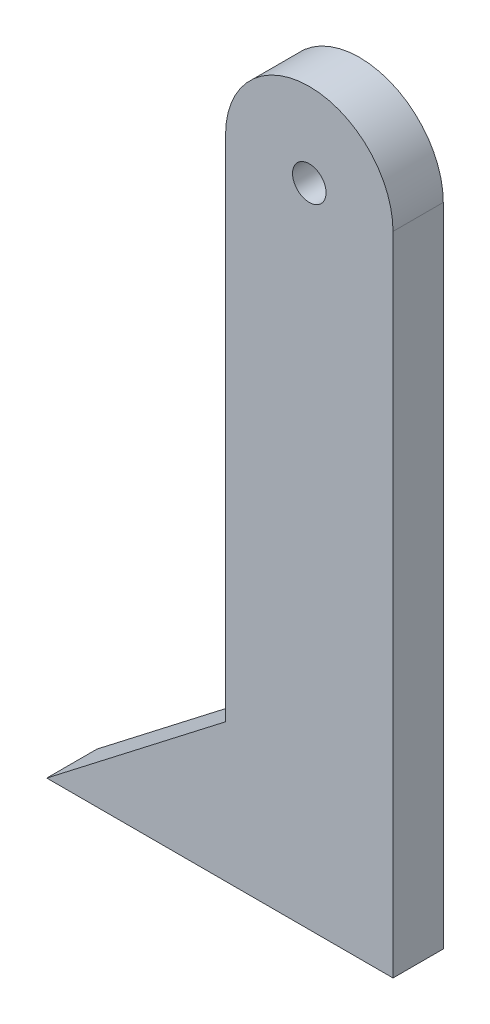
ISO-10303-21;
HEADER;
FILE_DESCRIPTION(('STEP AP214'),'2;1');
FILE_NAME('part.step','',(''),(''),'','','');
FILE_SCHEMA(('AUTOMOTIVE_DESIGN { 1 0 10303 214 1 1 1 1 }'));
ENDSEC;
DATA;
#1=APPLICATION_CONTEXT('core data for automotive mechanical design processes');
#2=APPLICATION_PROTOCOL_DEFINITION('international standard','automotive_design',2000,#1);
#3=PRODUCT_CONTEXT('',#1,'mechanical');
#4=PRODUCT('Part','Part','',(#3));
#5=PRODUCT_RELATED_PRODUCT_CATEGORY('part','',(#4));
#6=PRODUCT_DEFINITION_FORMATION('','',#4);
#7=PRODUCT_DEFINITION_CONTEXT('part definition',#1,'design');
#8=PRODUCT_DEFINITION('design','',#6,#7);
#9=PRODUCT_DEFINITION_SHAPE('','',#8);
#10=(LENGTH_UNIT() NAMED_UNIT(*) SI_UNIT(.MILLI.,.METRE.));
#11=(NAMED_UNIT(*) PLANE_ANGLE_UNIT() SI_UNIT($,.RADIAN.));
#12=(NAMED_UNIT(*) SI_UNIT($,.STERADIAN.) SOLID_ANGLE_UNIT());
#13=UNCERTAINTY_MEASURE_WITH_UNIT(LENGTH_MEASURE(1.E-05),#10,'distance_accuracy_value','');
#14=(GEOMETRIC_REPRESENTATION_CONTEXT(3) GLOBAL_UNCERTAINTY_ASSIGNED_CONTEXT((#13)) GLOBAL_UNIT_ASSIGNED_CONTEXT((#10,
#11,#12)) REPRESENTATION_CONTEXT('',''));
#15=CARTESIAN_POINT('',(0.,0.,0.));
#16=DIRECTION('',(0.,0.,1.));
#17=DIRECTION('',(1.,0.,0.));
#18=AXIS2_PLACEMENT_3D('',#15,#16,#17);
#19=CARTESIAN_POINT('',(0.,0.,3.));
#20=DIRECTION('',(0.,0.,1.));
#21=DIRECTION('',(1.,0.,0.));
#22=AXIS2_PLACEMENT_3D('',#19,#20,#21);
#23=PLANE('',#22);
#24=CARTESIAN_POINT('',(0.,0.,3.));
#25=DIRECTION('',(0.,0.,1.));
#26=DIRECTION('',(1.,0.,0.));
#27=AXIS2_PLACEMENT_3D('',#24,#25,#26);
#28=CIRCLE('',#27,5.);
#29=CARTESIAN_POINT('',(5.,0.,3.));
#30=VERTEX_POINT('',#29);
#31=CARTESIAN_POINT('',(-5.,0.,3.));
#32=VERTEX_POINT('',#31);
#33=EDGE_CURVE('E84',#30,#32,#28,.T.);
#34=ORIENTED_EDGE('',*,*,#33,.T.);
#35=DIRECTION('',(0.,-1.,0.));
#36=VECTOR('',#35,1.);
#37=CARTESIAN_POINT('',(-5.,0.,3.));
#38=LINE('',#37,#36);
#39=CARTESIAN_POINT('',(-5.,-30.3571469308916,3.));
#40=VERTEX_POINT('',#39);
#41=EDGE_CURVE('E77',#32,#40,#38,.T.);
#42=ORIENTED_EDGE('',*,*,#41,.T.);
#43=DIRECTION('',(-0.791336404704291,-0.611380973362507,0.));
#44=VECTOR('',#43,1.);
#45=CARTESIAN_POINT('',(12.8180977179818,-16.5910092155937,3.));
#46=LINE('',#45,#44);
#47=CARTESIAN_POINT('',(-15.6780694640441,-38.6069487392632,3.));
#48=VERTEX_POINT('',#47);
#49=EDGE_CURVE('E110',#40,#48,#46,.T.);
#50=ORIENTED_EDGE('',*,*,#49,.T.);
#51=DIRECTION('',(1.,0.,0.));
#52=VECTOR('',#51,1.);
#53=CARTESIAN_POINT('',(0.,-38.6069487392632,3.));
#54=LINE('',#53,#52);
#55=CARTESIAN_POINT('',(5.,-38.6069487392632,3.));
#56=VERTEX_POINT('',#55);
#57=EDGE_CURVE('E115',#48,#56,#54,.T.);
#58=ORIENTED_EDGE('',*,*,#57,.T.);
#59=DIRECTION('',(0.,1.,0.));
#60=VECTOR('',#59,1.);
#61=CARTESIAN_POINT('',(5.,-30.3571469308916,3.));
#62=LINE('',#61,#60);
#63=EDGE_CURVE('E52',#56,#30,#62,.T.);
#64=ORIENTED_EDGE('',*,*,#63,.T.);
#65=EDGE_LOOP('',(#34,#42,#50,#58,#64));
#66=FACE_BOUND('',#65,.T.);
#67=CARTESIAN_POINT('',(0.,0.,3.));
#68=DIRECTION('',(0.,0.,1.));
#69=DIRECTION('',(1.,0.,0.));
#70=AXIS2_PLACEMENT_3D('',#67,#68,#69);
#71=CIRCLE('',#70,1.);
#72=CARTESIAN_POINT('',(1.,0.,3.));
#73=VERTEX_POINT('',#72);
#74=EDGE_CURVE('E95',#73,#73,#71,.T.);
#75=ORIENTED_EDGE('',*,*,#74,.F.);
#76=EDGE_LOOP('',(#75));
#77=FACE_BOUND('',#76,.T.);
#78=ADVANCED_FACE('F35',(#66,#77),#23,.T.);
#79=CARTESIAN_POINT('',(0.,0.,0.));
#80=DIRECTION('',(0.,0.,1.));
#81=DIRECTION('',(1.,0.,0.));
#82=AXIS2_PLACEMENT_3D('',#79,#80,#81);
#83=PLANE('',#82);
#84=CARTESIAN_POINT('',(0.,0.,0.));
#85=DIRECTION('',(0.,0.,1.));
#86=DIRECTION('',(1.,0.,0.));
#87=AXIS2_PLACEMENT_3D('',#84,#85,#86);
#88=CIRCLE('',#87,5.);
#89=CARTESIAN_POINT('',(5.,0.,0.));
#90=VERTEX_POINT('',#89);
#91=CARTESIAN_POINT('',(-5.,0.,0.));
#92=VERTEX_POINT('',#91);
#93=EDGE_CURVE('E92',#90,#92,#88,.T.);
#94=ORIENTED_EDGE('',*,*,#93,.F.);
#95=DIRECTION('',(0.,1.,0.));
#96=VECTOR('',#95,1.);
#97=CARTESIAN_POINT('',(5.,-30.3571469308916,0.));
#98=LINE('',#97,#96);
#99=CARTESIAN_POINT('',(5.,-38.6069487392632,0.));
#100=VERTEX_POINT('',#99);
#101=EDGE_CURVE('E90',#100,#90,#98,.T.);
#102=ORIENTED_EDGE('',*,*,#101,.F.);
#103=DIRECTION('',(-1.,0.,0.));
#104=VECTOR('',#103,1.);
#105=CARTESIAN_POINT('',(0.,-38.6069487392632,0.));
#106=LINE('',#105,#104);
#107=CARTESIAN_POINT('',(-15.6780694640441,-38.6069487392632,0.));
#108=VERTEX_POINT('',#107);
#109=EDGE_CURVE('E124',#100,#108,#106,.T.);
#110=ORIENTED_EDGE('',*,*,#109,.T.);
#111=DIRECTION('',(0.791336404704291,0.611380973362507,0.));
#112=VECTOR('',#111,1.);
#113=CARTESIAN_POINT('',(12.8180977179818,-16.5910092155937,0.));
#114=LINE('',#113,#112);
#115=CARTESIAN_POINT('',(-5.,-30.3571469308916,0.));
#116=VERTEX_POINT('',#115);
#117=EDGE_CURVE('E108',#108,#116,#114,.T.);
#118=ORIENTED_EDGE('',*,*,#117,.T.);
#119=DIRECTION('',(0.,-1.,0.));
#120=VECTOR('',#119,1.);
#121=CARTESIAN_POINT('',(-5.,0.,0.));
#122=LINE('',#121,#120);
#123=EDGE_CURVE('E65',#92,#116,#122,.T.);
#124=ORIENTED_EDGE('',*,*,#123,.F.);
#125=EDGE_LOOP('',(#94,#102,#110,#118,#124));
#126=FACE_BOUND('',#125,.T.);
#127=CARTESIAN_POINT('',(0.,0.,0.));
#128=DIRECTION('',(0.,0.,1.));
#129=DIRECTION('',(1.,0.,0.));
#130=AXIS2_PLACEMENT_3D('',#127,#128,#129);
#131=CIRCLE('',#130,1.);
#132=CARTESIAN_POINT('',(1.,0.,0.));
#133=VERTEX_POINT('',#132);
#134=EDGE_CURVE('E99',#133,#133,#131,.T.);
#135=ORIENTED_EDGE('',*,*,#134,.T.);
#136=EDGE_LOOP('',(#135));
#137=FACE_BOUND('',#136,.T.);
#138=ADVANCED_FACE('F129',(#126,#137),#83,.F.);
#139=CARTESIAN_POINT('',(0.,0.,3.));
#140=DIRECTION('',(0.,0.,-1.));
#141=DIRECTION('',(-1.,0.,0.));
#142=AXIS2_PLACEMENT_3D('',#139,#140,#141);
#143=CYLINDRICAL_SURFACE('',#142,5.);
#144=ORIENTED_EDGE('',*,*,#93,.T.);
#145=DIRECTION('',(0.,0.,-1.));
#146=VECTOR('',#145,1.);
#147=CARTESIAN_POINT('',(-5.,0.,3.));
#148=LINE('',#147,#146);
#149=EDGE_CURVE('E11',#32,#92,#148,.T.);
#150=ORIENTED_EDGE('',*,*,#149,.F.);
#151=ORIENTED_EDGE('',*,*,#33,.F.);
#152=DIRECTION('',(0.,0.,-1.));
#153=VECTOR('',#152,1.);
#154=CARTESIAN_POINT('',(5.,0.,3.));
#155=LINE('',#154,#153);
#156=EDGE_CURVE('E93',#30,#90,#155,.T.);
#157=ORIENTED_EDGE('',*,*,#156,.T.);
#158=EDGE_LOOP('',(#144,#150,#151,#157));
#159=FACE_BOUND('',#158,.T.);
#160=ADVANCED_FACE('F37',(#159),#143,.T.);
#161=CARTESIAN_POINT('',(-5.,0.,3.));
#162=DIRECTION('',(1.,0.,0.));
#163=DIRECTION('',(0.,0.,-1.));
#164=AXIS2_PLACEMENT_3D('',#161,#162,#163);
#165=PLANE('',#164);
#166=ORIENTED_EDGE('',*,*,#123,.T.);
#167=DIRECTION('',(0.,0.,-1.));
#168=VECTOR('',#167,1.);
#169=CARTESIAN_POINT('',(-5.,-30.3571469308916,3.));
#170=LINE('',#169,#168);
#171=EDGE_CURVE('E44',#40,#116,#170,.T.);
#172=ORIENTED_EDGE('',*,*,#171,.F.);
#173=ORIENTED_EDGE('',*,*,#41,.F.);
#174=ORIENTED_EDGE('',*,*,#149,.T.);
#175=EDGE_LOOP('',(#166,#172,#173,#174));
#176=FACE_BOUND('',#175,.T.);
#177=ADVANCED_FACE('F78',(#176),#165,.F.);
#178=CARTESIAN_POINT('',(5.,-30.3571469308916,3.));
#179=DIRECTION('',(-1.,0.,0.));
#180=DIRECTION('',(0.,0.,1.));
#181=AXIS2_PLACEMENT_3D('',#178,#179,#180);
#182=PLANE('',#181);
#183=ORIENTED_EDGE('',*,*,#101,.T.);
#184=ORIENTED_EDGE('',*,*,#156,.F.);
#185=ORIENTED_EDGE('',*,*,#63,.F.);
#186=DIRECTION('',(0.,0.,1.));
#187=VECTOR('',#186,1.);
#188=CARTESIAN_POINT('',(5.,-38.6069487392632,-22.2630138713797));
#189=LINE('',#188,#187);
#190=EDGE_CURVE('E114',#100,#56,#189,.T.);
#191=ORIENTED_EDGE('',*,*,#190,.F.);
#192=EDGE_LOOP('',(#183,#184,#185,#191));
#193=FACE_BOUND('',#192,.T.);
#194=ADVANCED_FACE('F139',(#193),#182,.F.);
#195=CARTESIAN_POINT('',(0.,0.,3.));
#196=DIRECTION('',(0.,0.,-1.));
#197=DIRECTION('',(-1.,0.,0.));
#198=AXIS2_PLACEMENT_3D('',#195,#196,#197);
#199=CYLINDRICAL_SURFACE('',#198,1.);
#200=ORIENTED_EDGE('',*,*,#74,.T.);
#201=EDGE_LOOP('',(#200));
#202=FACE_BOUND('',#201,.T.);
#203=ORIENTED_EDGE('',*,*,#134,.F.);
#204=EDGE_LOOP('',(#203));
#205=FACE_BOUND('',#204,.T.);
#206=ADVANCED_FACE('F141',(#202,#205),#199,.F.);
#207=CARTESIAN_POINT('',(0.,-38.6069487392632,-22.2630138713797));
#208=DIRECTION('',(0.,-1.,0.));
#209=DIRECTION('',(0.,0.,-1.));
#210=AXIS2_PLACEMENT_3D('',#207,#208,#209);
#211=PLANE('',#210);
#212=ORIENTED_EDGE('',*,*,#109,.F.);
#213=ORIENTED_EDGE('',*,*,#190,.T.);
#214=ORIENTED_EDGE('',*,*,#57,.F.);
#215=DIRECTION('',(0.,0.,1.));
#216=VECTOR('',#215,1.);
#217=CARTESIAN_POINT('',(-15.6780694640441,-38.6069487392632,-22.2630138713797));
#218=LINE('',#217,#216);
#219=EDGE_CURVE('E112',#108,#48,#218,.T.);
#220=ORIENTED_EDGE('',*,*,#219,.F.);
#221=EDGE_LOOP('',(#212,#213,#214,#220));
#222=FACE_BOUND('',#221,.T.);
#223=ADVANCED_FACE('F159',(#222),#211,.T.);
#224=CARTESIAN_POINT('',(12.8180977179818,-16.5910092155937,-22.2630138713797));
#225=DIRECTION('',(-0.611380973362507,0.791336404704291,0.));
#226=DIRECTION('',(-0.791336404704291,-0.611380973362507,0.));
#227=AXIS2_PLACEMENT_3D('',#224,#225,#226);
#228=PLANE('',#227);
#229=ORIENTED_EDGE('',*,*,#117,.F.);
#230=ORIENTED_EDGE('',*,*,#219,.T.);
#231=ORIENTED_EDGE('',*,*,#49,.F.);
#232=ORIENTED_EDGE('',*,*,#171,.T.);
#233=EDGE_LOOP('',(#229,#230,#231,#232));
#234=FACE_BOUND('',#233,.T.);
#235=ADVANCED_FACE('F106',(#234),#228,.T.);
#236=CLOSED_SHELL('',(#78,#138,#160,#177,#194,#206,#223,#235));
#237=MANIFOLD_SOLID_BREP('B2',#236);
#238=ADVANCED_BREP_SHAPE_REPRESENTATION('',(#18,#237),#14);
#239=SHAPE_DEFINITION_REPRESENTATION(#9,#238);
ENDSEC;
END-ISO-10303-21;
